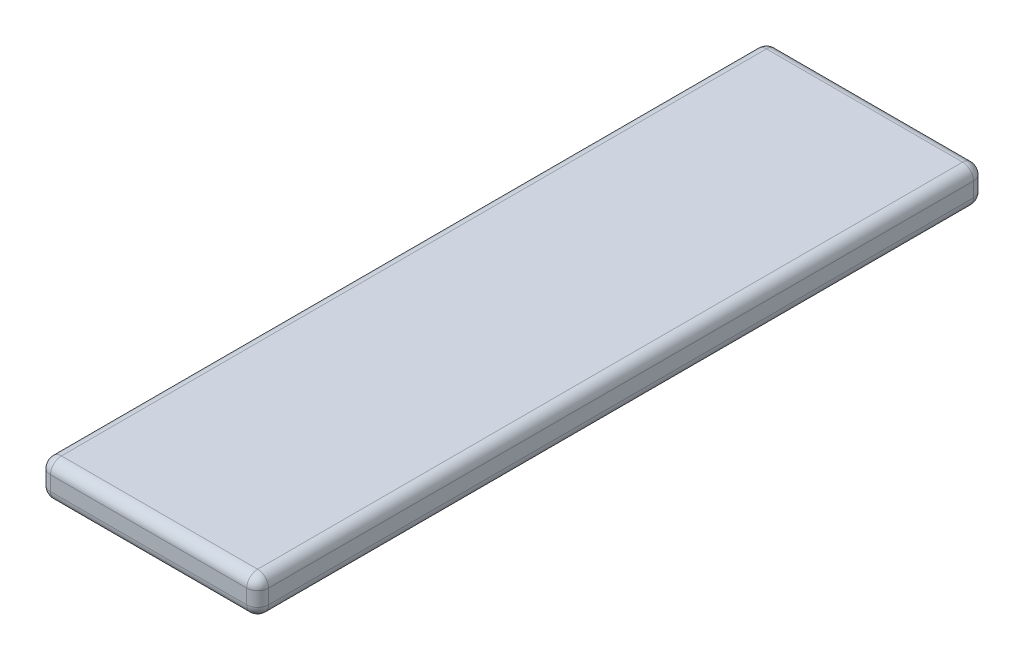
ISO-10303-21;
HEADER;
FILE_DESCRIPTION(('STEP AP214'),'2;1');
FILE_NAME('part.step','',(''),(''),'','','');
FILE_SCHEMA(('AUTOMOTIVE_DESIGN { 1 0 10303 214 1 1 1 1 }'));
ENDSEC;
DATA;
#1=APPLICATION_CONTEXT('core data for automotive mechanical design processes');
#2=APPLICATION_PROTOCOL_DEFINITION('international standard','automotive_design',2000,#1);
#3=PRODUCT_CONTEXT('',#1,'mechanical');
#4=PRODUCT('Part','Part','',(#3));
#5=PRODUCT_RELATED_PRODUCT_CATEGORY('part','',(#4));
#6=PRODUCT_DEFINITION_FORMATION('','',#4);
#7=PRODUCT_DEFINITION_CONTEXT('part definition',#1,'design');
#8=PRODUCT_DEFINITION('design','',#6,#7);
#9=PRODUCT_DEFINITION_SHAPE('','',#8);
#10=(LENGTH_UNIT() NAMED_UNIT(*) SI_UNIT(.MILLI.,.METRE.));
#11=(NAMED_UNIT(*) PLANE_ANGLE_UNIT() SI_UNIT($,.RADIAN.));
#12=(NAMED_UNIT(*) SI_UNIT($,.STERADIAN.) SOLID_ANGLE_UNIT());
#13=UNCERTAINTY_MEASURE_WITH_UNIT(LENGTH_MEASURE(1.E-05),#10,'distance_accuracy_value','');
#14=(GEOMETRIC_REPRESENTATION_CONTEXT(3) GLOBAL_UNCERTAINTY_ASSIGNED_CONTEXT((#13)) GLOBAL_UNIT_ASSIGNED_CONTEXT((#10,
#11,#12)) REPRESENTATION_CONTEXT('',''));
#15=CARTESIAN_POINT('',(0.,0.,0.));
#16=DIRECTION('',(0.,0.,1.));
#17=DIRECTION('',(1.,0.,0.));
#18=AXIS2_PLACEMENT_3D('',#15,#16,#17);
#19=CARTESIAN_POINT('',(-300.,100.,-1000.));
#20=DIRECTION('',(1.,0.,0.));
#21=DIRECTION('',(0.,0.,-1.));
#22=AXIS2_PLACEMENT_3D('',#19,#20,#21);
#23=PLANE('',#22);
#24=DIRECTION('',(0.,0.,1.));
#25=VECTOR('',#24,1.);
#26=CARTESIAN_POINT('',(-300.,30.,1000.));
#27=LINE('',#26,#25);
#28=CARTESIAN_POINT('',(-300.,30.,-970.));
#29=VERTEX_POINT('',#28);
#30=CARTESIAN_POINT('',(-300.,30.,970.));
#31=VERTEX_POINT('',#30);
#32=EDGE_CURVE('E280',#29,#31,#27,.T.);
#33=ORIENTED_EDGE('',*,*,#32,.T.);
#34=DIRECTION('',(0.,-1.,0.));
#35=VECTOR('',#34,1.);
#36=CARTESIAN_POINT('',(-300.,100.,970.));
#37=LINE('',#36,#35);
#38=CARTESIAN_POINT('',(-300.,70.,970.));
#39=VERTEX_POINT('',#38);
#40=EDGE_CURVE('E212',#31,#39,#37,.F.);
#41=ORIENTED_EDGE('',*,*,#40,.T.);
#42=DIRECTION('',(0.,0.,1.));
#43=VECTOR('',#42,1.);
#44=CARTESIAN_POINT('',(-300.,70.,-1000.));
#45=LINE('',#44,#43);
#46=CARTESIAN_POINT('',(-300.,70.,-970.));
#47=VERTEX_POINT('',#46);
#48=EDGE_CURVE('E273',#39,#47,#45,.F.);
#49=ORIENTED_EDGE('',*,*,#48,.T.);
#50=DIRECTION('',(0.,-1.,0.));
#51=VECTOR('',#50,1.);
#52=CARTESIAN_POINT('',(-300.,100.,-970.));
#53=LINE('',#52,#51);
#54=EDGE_CURVE('E275',#47,#29,#53,.T.);
#55=ORIENTED_EDGE('',*,*,#54,.T.);
#56=EDGE_LOOP('',(#33,#41,#49,#55));
#57=FACE_BOUND('',#56,.T.);
#58=ADVANCED_FACE('F33',(#57),#23,.F.);
#59=CARTESIAN_POINT('',(300.,100.,1000.));
#60=DIRECTION('',(0.,0.,-1.));
#61=DIRECTION('',(-1.,0.,0.));
#62=AXIS2_PLACEMENT_3D('',#59,#60,#61);
#63=PLANE('',#62);
#64=DIRECTION('',(0.,-1.,0.));
#65=VECTOR('',#64,1.);
#66=CARTESIAN_POINT('',(-270.,100.,1000.));
#67=LINE('',#66,#65);
#68=CARTESIAN_POINT('',(-270.,70.,1000.));
#69=VERTEX_POINT('',#68);
#70=CARTESIAN_POINT('',(-270.,30.,1000.));
#71=VERTEX_POINT('',#70);
#72=EDGE_CURVE('E131',#69,#71,#67,.T.);
#73=ORIENTED_EDGE('',*,*,#72,.T.);
#74=DIRECTION('',(1.,0.,0.));
#75=VECTOR('',#74,1.);
#76=CARTESIAN_POINT('',(300.,30.,1000.));
#77=LINE('',#76,#75);
#78=CARTESIAN_POINT('',(270.,30.,1000.));
#79=VERTEX_POINT('',#78);
#80=EDGE_CURVE('E127',#71,#79,#77,.T.);
#81=ORIENTED_EDGE('',*,*,#80,.T.);
#82=DIRECTION('',(0.,-1.,0.));
#83=VECTOR('',#82,1.);
#84=CARTESIAN_POINT('',(270.,100.,1000.));
#85=LINE('',#84,#83);
#86=CARTESIAN_POINT('',(270.,70.,1000.));
#87=VERTEX_POINT('',#86);
#88=EDGE_CURVE('E121',#79,#87,#85,.F.);
#89=ORIENTED_EDGE('',*,*,#88,.T.);
#90=DIRECTION('',(1.,0.,0.));
#91=VECTOR('',#90,1.);
#92=CARTESIAN_POINT('',(300.,70.,1000.));
#93=LINE('',#92,#91);
#94=EDGE_CURVE('E124',#87,#69,#93,.F.);
#95=ORIENTED_EDGE('',*,*,#94,.T.);
#96=EDGE_LOOP('',(#73,#81,#89,#95));
#97=FACE_BOUND('',#96,.T.);
#98=ADVANCED_FACE('F123',(#97),#63,.F.);
#99=CARTESIAN_POINT('',(300.,100.,-1000.));
#100=DIRECTION('',(-1.,0.,0.));
#101=DIRECTION('',(0.,0.,1.));
#102=AXIS2_PLACEMENT_3D('',#99,#100,#101);
#103=PLANE('',#102);
#104=DIRECTION('',(0.,-1.,0.));
#105=VECTOR('',#104,1.);
#106=CARTESIAN_POINT('',(300.,100.,970.));
#107=LINE('',#106,#105);
#108=CARTESIAN_POINT('',(300.,70.,970.));
#109=VERTEX_POINT('',#108);
#110=CARTESIAN_POINT('',(300.,30.,970.));
#111=VERTEX_POINT('',#110);
#112=EDGE_CURVE('E153',#109,#111,#107,.T.);
#113=ORIENTED_EDGE('',*,*,#112,.T.);
#114=DIRECTION('',(0.,0.,-1.));
#115=VECTOR('',#114,1.);
#116=CARTESIAN_POINT('',(300.,30.,-1000.));
#117=LINE('',#116,#115);
#118=CARTESIAN_POINT('',(300.,30.,-970.));
#119=VERTEX_POINT('',#118);
#120=EDGE_CURVE('E231',#111,#119,#117,.T.);
#121=ORIENTED_EDGE('',*,*,#120,.T.);
#122=DIRECTION('',(0.,-1.,0.));
#123=VECTOR('',#122,1.);
#124=CARTESIAN_POINT('',(300.,100.,-970.));
#125=LINE('',#124,#123);
#126=CARTESIAN_POINT('',(300.,70.,-970.));
#127=VERTEX_POINT('',#126);
#128=EDGE_CURVE('E224',#119,#127,#125,.F.);
#129=ORIENTED_EDGE('',*,*,#128,.T.);
#130=DIRECTION('',(0.,0.,-1.));
#131=VECTOR('',#130,1.);
#132=CARTESIAN_POINT('',(300.,70.,-1000.));
#133=LINE('',#132,#131);
#134=EDGE_CURVE('E222',#127,#109,#133,.F.);
#135=ORIENTED_EDGE('',*,*,#134,.T.);
#136=EDGE_LOOP('',(#113,#121,#129,#135));
#137=FACE_BOUND('',#136,.T.);
#138=ADVANCED_FACE('F324',(#137),#103,.F.);
#139=CARTESIAN_POINT('',(300.,100.,-1000.));
#140=DIRECTION('',(0.,0.,1.));
#141=DIRECTION('',(1.,0.,0.));
#142=AXIS2_PLACEMENT_3D('',#139,#140,#141);
#143=PLANE('',#142);
#144=DIRECTION('',(-1.,0.,0.));
#145=VECTOR('',#144,1.);
#146=CARTESIAN_POINT('',(-300.,30.,-1000.));
#147=LINE('',#146,#145);
#148=CARTESIAN_POINT('',(270.,30.,-1000.));
#149=VERTEX_POINT('',#148);
#150=CARTESIAN_POINT('',(-270.,30.,-1000.));
#151=VERTEX_POINT('',#150);
#152=EDGE_CURVE('E218',#149,#151,#147,.T.);
#153=ORIENTED_EDGE('',*,*,#152,.T.);
#154=DIRECTION('',(0.,-1.,0.));
#155=VECTOR('',#154,1.);
#156=CARTESIAN_POINT('',(-270.,100.,-1000.));
#157=LINE('',#156,#155);
#158=CARTESIAN_POINT('',(-270.,70.,-1000.));
#159=VERTEX_POINT('',#158);
#160=EDGE_CURVE('E215',#151,#159,#157,.F.);
#161=ORIENTED_EDGE('',*,*,#160,.T.);
#162=DIRECTION('',(-1.,0.,0.));
#163=VECTOR('',#162,1.);
#164=CARTESIAN_POINT('',(300.,70.,-1000.));
#165=LINE('',#164,#163);
#166=CARTESIAN_POINT('',(270.,70.,-1000.));
#167=VERTEX_POINT('',#166);
#168=EDGE_CURVE('E208',#159,#167,#165,.F.);
#169=ORIENTED_EDGE('',*,*,#168,.T.);
#170=DIRECTION('',(0.,-1.,0.));
#171=VECTOR('',#170,1.);
#172=CARTESIAN_POINT('',(270.,100.,-1000.));
#173=LINE('',#172,#171);
#174=EDGE_CURVE('E211',#167,#149,#173,.T.);
#175=ORIENTED_EDGE('',*,*,#174,.T.);
#176=EDGE_LOOP('',(#153,#161,#169,#175));
#177=FACE_BOUND('',#176,.T.);
#178=ADVANCED_FACE('F216',(#177),#143,.F.);
#179=CARTESIAN_POINT('',(0.,100.,0.));
#180=DIRECTION('',(0.,-1.,0.));
#181=DIRECTION('',(0.,0.,-1.));
#182=AXIS2_PLACEMENT_3D('',#179,#180,#181);
#183=PLANE('',#182);
#184=DIRECTION('',(0.,0.,-1.));
#185=VECTOR('',#184,1.);
#186=CARTESIAN_POINT('',(270.,100.,0.));
#187=LINE('',#186,#185);
#188=CARTESIAN_POINT('',(270.,100.,970.));
#189=VERTEX_POINT('',#188);
#190=CARTESIAN_POINT('',(270.,100.,-970.));
#191=VERTEX_POINT('',#190);
#192=EDGE_CURVE('E42',#189,#191,#187,.T.);
#193=ORIENTED_EDGE('',*,*,#192,.T.);
#194=DIRECTION('',(-1.,0.,0.));
#195=VECTOR('',#194,1.);
#196=CARTESIAN_POINT('',(0.,100.,-970.));
#197=LINE('',#196,#195);
#198=CARTESIAN_POINT('',(-270.,100.,-970.));
#199=VERTEX_POINT('',#198);
#200=EDGE_CURVE('E11',#191,#199,#197,.T.);
#201=ORIENTED_EDGE('',*,*,#200,.T.);
#202=DIRECTION('',(0.,0.,1.));
#203=VECTOR('',#202,1.);
#204=CARTESIAN_POINT('',(-270.,100.,0.));
#205=LINE('',#204,#203);
#206=CARTESIAN_POINT('',(-270.,100.,970.));
#207=VERTEX_POINT('',#206);
#208=EDGE_CURVE('E233',#199,#207,#205,.T.);
#209=ORIENTED_EDGE('',*,*,#208,.T.);
#210=DIRECTION('',(1.,0.,0.));
#211=VECTOR('',#210,1.);
#212=CARTESIAN_POINT('',(0.,100.,970.));
#213=LINE('',#212,#211);
#214=EDGE_CURVE('E53',#207,#189,#213,.T.);
#215=ORIENTED_EDGE('',*,*,#214,.T.);
#216=EDGE_LOOP('',(#193,#201,#209,#215));
#217=FACE_BOUND('',#216,.T.);
#218=ADVANCED_FACE('F482',(#217),#183,.F.);
#219=CARTESIAN_POINT('',(0.,0.,0.));
#220=DIRECTION('',(0.,-1.,0.));
#221=DIRECTION('',(0.,0.,-1.));
#222=AXIS2_PLACEMENT_3D('',#219,#220,#221);
#223=PLANE('',#222);
#224=DIRECTION('',(0.,0.,-1.));
#225=VECTOR('',#224,1.);
#226=CARTESIAN_POINT('',(270.,0.,1000.));
#227=LINE('',#226,#225);
#228=CARTESIAN_POINT('',(270.,0.,-970.));
#229=VERTEX_POINT('',#228);
#230=CARTESIAN_POINT('',(270.,0.,970.));
#231=VERTEX_POINT('',#230);
#232=EDGE_CURVE('E269',#229,#231,#227,.F.);
#233=ORIENTED_EDGE('',*,*,#232,.T.);
#234=DIRECTION('',(1.,0.,0.));
#235=VECTOR('',#234,1.);
#236=CARTESIAN_POINT('',(-300.,0.,970.));
#237=LINE('',#236,#235);
#238=CARTESIAN_POINT('',(-270.,0.,970.));
#239=VERTEX_POINT('',#238);
#240=EDGE_CURVE('E263',#231,#239,#237,.F.);
#241=ORIENTED_EDGE('',*,*,#240,.T.);
#242=DIRECTION('',(0.,0.,1.));
#243=VECTOR('',#242,1.);
#244=CARTESIAN_POINT('',(-270.,0.,-1000.));
#245=LINE('',#244,#243);
#246=CARTESIAN_POINT('',(-270.,0.,-970.));
#247=VERTEX_POINT('',#246);
#248=EDGE_CURVE('E257',#239,#247,#245,.F.);
#249=ORIENTED_EDGE('',*,*,#248,.T.);
#250=DIRECTION('',(-1.,0.,0.));
#251=VECTOR('',#250,1.);
#252=CARTESIAN_POINT('',(300.,0.,-970.));
#253=LINE('',#252,#251);
#254=EDGE_CURVE('E264',#247,#229,#253,.F.);
#255=ORIENTED_EDGE('',*,*,#254,.T.);
#256=EDGE_LOOP('',(#233,#241,#249,#255));
#257=FACE_BOUND('',#256,.T.);
#258=ADVANCED_FACE('F267',(#257),#223,.T.);
#259=CARTESIAN_POINT('',(0.,70.,-970.));
#260=DIRECTION('',(-1.,0.,0.));
#261=DIRECTION('',(0.,0.,1.));
#262=AXIS2_PLACEMENT_3D('',#259,#260,#261);
#263=CYLINDRICAL_SURFACE('',#262,30.);
#264=CARTESIAN_POINT('',(-270.,70.,-970.));
#265=DIRECTION('',(-1.,0.,0.));
#266=DIRECTION('',(0.,0.,1.));
#267=AXIS2_PLACEMENT_3D('',#264,#265,#266);
#268=CIRCLE('',#267,30.);
#269=EDGE_CURVE('E37',#199,#159,#268,.T.);
#270=ORIENTED_EDGE('',*,*,#269,.F.);
#271=ORIENTED_EDGE('',*,*,#200,.F.);
#272=CARTESIAN_POINT('',(270.,70.,-970.));
#273=DIRECTION('',(1.,0.,0.));
#274=DIRECTION('',(0.,0.,-1.));
#275=AXIS2_PLACEMENT_3D('',#272,#273,#274);
#276=CIRCLE('',#275,30.);
#277=EDGE_CURVE('E193',#167,#191,#276,.T.);
#278=ORIENTED_EDGE('',*,*,#277,.F.);
#279=ORIENTED_EDGE('',*,*,#168,.F.);
#280=EDGE_LOOP('',(#270,#271,#278,#279));
#281=FACE_BOUND('',#280,.T.);
#282=ADVANCED_FACE('F35',(#281),#263,.T.);
#283=CARTESIAN_POINT('',(-270.,70.,-970.));
#284=DIRECTION('',(0.,0.,1.));
#285=DIRECTION('',(1.,0.,0.));
#286=AXIS2_PLACEMENT_3D('',#283,#284,#285);
#287=SPHERICAL_SURFACE('',#286,30.);
#288=CARTESIAN_POINT('',(-270.,70.,-970.));
#289=DIRECTION('',(0.,0.,-1.));
#290=DIRECTION('',(-1.,0.,0.));
#291=AXIS2_PLACEMENT_3D('',#288,#289,#290);
#292=CIRCLE('',#291,30.);
#293=EDGE_CURVE('E189',#199,#47,#292,.F.);
#294=ORIENTED_EDGE('',*,*,#293,.F.);
#295=ORIENTED_EDGE('',*,*,#269,.T.);
#296=CARTESIAN_POINT('',(-270.,70.,-970.));
#297=DIRECTION('',(0.,1.,0.));
#298=DIRECTION('',(0.,0.,1.));
#299=AXIS2_PLACEMENT_3D('',#296,#297,#298);
#300=CIRCLE('',#299,30.);
#301=EDGE_CURVE('E192',#47,#159,#300,.F.);
#302=ORIENTED_EDGE('',*,*,#301,.F.);
#303=EDGE_LOOP('',(#294,#295,#302));
#304=FACE_BOUND('',#303,.T.);
#305=ADVANCED_FACE('F205',(#304),#287,.T.);
#306=CARTESIAN_POINT('',(270.,70.,-970.));
#307=DIRECTION('',(0.,0.,1.));
#308=DIRECTION('',(1.,0.,0.));
#309=AXIS2_PLACEMENT_3D('',#306,#307,#308);
#310=SPHERICAL_SURFACE('',#309,30.);
#311=CARTESIAN_POINT('',(270.,70.,-970.));
#312=DIRECTION('',(0.,1.,0.));
#313=DIRECTION('',(0.,0.,1.));
#314=AXIS2_PLACEMENT_3D('',#311,#312,#313);
#315=CIRCLE('',#314,30.);
#316=EDGE_CURVE('E183',#167,#127,#315,.F.);
#317=ORIENTED_EDGE('',*,*,#316,.F.);
#318=ORIENTED_EDGE('',*,*,#277,.T.);
#319=CARTESIAN_POINT('',(270.,70.,-970.));
#320=DIRECTION('',(0.,0.,-1.));
#321=DIRECTION('',(-1.,0.,0.));
#322=AXIS2_PLACEMENT_3D('',#319,#320,#321);
#323=CIRCLE('',#322,30.);
#324=EDGE_CURVE('E186',#127,#191,#323,.F.);
#325=ORIENTED_EDGE('',*,*,#324,.F.);
#326=EDGE_LOOP('',(#317,#318,#325));
#327=FACE_BOUND('',#326,.T.);
#328=ADVANCED_FACE('F455',(#327),#310,.T.);
#329=CARTESIAN_POINT('',(-270.,100.,-970.));
#330=DIRECTION('',(0.,-1.,0.));
#331=DIRECTION('',(0.,0.,-1.));
#332=AXIS2_PLACEMENT_3D('',#329,#330,#331);
#333=CYLINDRICAL_SURFACE('',#332,30.);
#334=ORIENTED_EDGE('',*,*,#301,.T.);
#335=ORIENTED_EDGE('',*,*,#160,.F.);
#336=CARTESIAN_POINT('',(-270.,30.,-970.));
#337=DIRECTION('',(0.,-1.,0.));
#338=DIRECTION('',(0.,0.,-1.));
#339=AXIS2_PLACEMENT_3D('',#336,#337,#338);
#340=CIRCLE('',#339,30.);
#341=EDGE_CURVE('E177',#29,#151,#340,.T.);
#342=ORIENTED_EDGE('',*,*,#341,.F.);
#343=ORIENTED_EDGE('',*,*,#54,.F.);
#344=EDGE_LOOP('',(#334,#335,#342,#343));
#345=FACE_BOUND('',#344,.T.);
#346=ADVANCED_FACE('F306',(#345),#333,.T.);
#347=CARTESIAN_POINT('',(-270.,70.,0.));
#348=DIRECTION('',(0.,0.,1.));
#349=DIRECTION('',(1.,0.,0.));
#350=AXIS2_PLACEMENT_3D('',#347,#348,#349);
#351=CYLINDRICAL_SURFACE('',#350,30.);
#352=ORIENTED_EDGE('',*,*,#293,.T.);
#353=ORIENTED_EDGE('',*,*,#48,.F.);
#354=CARTESIAN_POINT('',(-270.,70.,970.));
#355=DIRECTION('',(0.,0.,1.));
#356=DIRECTION('',(1.,0.,0.));
#357=AXIS2_PLACEMENT_3D('',#354,#355,#356);
#358=CIRCLE('',#357,30.);
#359=EDGE_CURVE('E174',#207,#39,#358,.T.);
#360=ORIENTED_EDGE('',*,*,#359,.F.);
#361=ORIENTED_EDGE('',*,*,#208,.F.);
#362=EDGE_LOOP('',(#352,#353,#360,#361));
#363=FACE_BOUND('',#362,.T.);
#364=ADVANCED_FACE('F439',(#363),#351,.T.);
#365=CARTESIAN_POINT('',(0.,70.,970.));
#366=DIRECTION('',(1.,0.,0.));
#367=DIRECTION('',(0.,0.,-1.));
#368=AXIS2_PLACEMENT_3D('',#365,#366,#367);
#369=CYLINDRICAL_SURFACE('',#368,30.);
#370=CARTESIAN_POINT('',(270.,70.,970.));
#371=DIRECTION('',(1.,0.,0.));
#372=DIRECTION('',(0.,0.,-1.));
#373=AXIS2_PLACEMENT_3D('',#370,#371,#372);
#374=CIRCLE('',#373,30.);
#375=EDGE_CURVE('E137',#189,#87,#374,.T.);
#376=ORIENTED_EDGE('',*,*,#375,.F.);
#377=ORIENTED_EDGE('',*,*,#214,.F.);
#378=CARTESIAN_POINT('',(-270.,70.,970.));
#379=DIRECTION('',(-1.,0.,0.));
#380=DIRECTION('',(0.,-1.,0.));
#381=AXIS2_PLACEMENT_3D('',#378,#379,#380);
#382=CIRCLE('',#381,30.);
#383=EDGE_CURVE('E140',#69,#207,#382,.T.);
#384=ORIENTED_EDGE('',*,*,#383,.F.);
#385=ORIENTED_EDGE('',*,*,#94,.F.);
#386=EDGE_LOOP('',(#376,#377,#384,#385));
#387=FACE_BOUND('',#386,.T.);
#388=ADVANCED_FACE('F136',(#387),#369,.T.);
#389=CARTESIAN_POINT('',(270.,70.,0.));
#390=DIRECTION('',(0.,0.,-1.));
#391=DIRECTION('',(-1.,0.,0.));
#392=AXIS2_PLACEMENT_3D('',#389,#390,#391);
#393=CYLINDRICAL_SURFACE('',#392,30.);
#394=ORIENTED_EDGE('',*,*,#324,.T.);
#395=ORIENTED_EDGE('',*,*,#192,.F.);
#396=CARTESIAN_POINT('',(270.,70.,970.));
#397=DIRECTION('',(0.,0.,1.));
#398=DIRECTION('',(1.,0.,0.));
#399=AXIS2_PLACEMENT_3D('',#396,#397,#398);
#400=CIRCLE('',#399,30.);
#401=EDGE_CURVE('E149',#109,#189,#400,.T.);
#402=ORIENTED_EDGE('',*,*,#401,.F.);
#403=ORIENTED_EDGE('',*,*,#134,.F.);
#404=EDGE_LOOP('',(#394,#395,#402,#403));
#405=FACE_BOUND('',#404,.T.);
#406=ADVANCED_FACE('F423',(#405),#393,.T.);
#407=CARTESIAN_POINT('',(270.,100.,-970.));
#408=DIRECTION('',(0.,-1.,0.));
#409=DIRECTION('',(0.,0.,-1.));
#410=AXIS2_PLACEMENT_3D('',#407,#408,#409);
#411=CYLINDRICAL_SURFACE('',#410,30.);
#412=ORIENTED_EDGE('',*,*,#316,.T.);
#413=ORIENTED_EDGE('',*,*,#128,.F.);
#414=CARTESIAN_POINT('',(270.,30.,-970.));
#415=DIRECTION('',(0.,-1.,0.));
#416=DIRECTION('',(0.,0.,-1.));
#417=AXIS2_PLACEMENT_3D('',#414,#415,#416);
#418=CIRCLE('',#417,30.);
#419=EDGE_CURVE('E169',#149,#119,#418,.T.);
#420=ORIENTED_EDGE('',*,*,#419,.F.);
#421=ORIENTED_EDGE('',*,*,#174,.F.);
#422=EDGE_LOOP('',(#412,#413,#420,#421));
#423=FACE_BOUND('',#422,.T.);
#424=ADVANCED_FACE('F291',(#423),#411,.T.);
#425=CARTESIAN_POINT('',(300.,30.,-970.));
#426=DIRECTION('',(1.,0.,0.));
#427=DIRECTION('',(0.,0.,-1.));
#428=AXIS2_PLACEMENT_3D('',#425,#426,#427);
#429=CYLINDRICAL_SURFACE('',#428,30.);
#430=CARTESIAN_POINT('',(-270.,30.,-970.));
#431=DIRECTION('',(-1.,0.,0.));
#432=DIRECTION('',(0.,0.,1.));
#433=AXIS2_PLACEMENT_3D('',#430,#431,#432);
#434=CIRCLE('',#433,30.);
#435=EDGE_CURVE('E180',#151,#247,#434,.T.);
#436=ORIENTED_EDGE('',*,*,#435,.F.);
#437=ORIENTED_EDGE('',*,*,#152,.F.);
#438=CARTESIAN_POINT('',(270.,30.,-970.));
#439=DIRECTION('',(1.,0.,0.));
#440=DIRECTION('',(0.,0.,-1.));
#441=AXIS2_PLACEMENT_3D('',#438,#439,#440);
#442=CIRCLE('',#441,30.);
#443=EDGE_CURVE('E166',#229,#149,#442,.T.);
#444=ORIENTED_EDGE('',*,*,#443,.F.);
#445=ORIENTED_EDGE('',*,*,#254,.F.);
#446=EDGE_LOOP('',(#436,#437,#444,#445));
#447=FACE_BOUND('',#446,.T.);
#448=ADVANCED_FACE('F288',(#447),#429,.T.);
#449=CARTESIAN_POINT('',(-270.,30.,-970.));
#450=DIRECTION('',(0.,0.,1.));
#451=DIRECTION('',(1.,0.,0.));
#452=AXIS2_PLACEMENT_3D('',#449,#450,#451);
#453=SPHERICAL_SURFACE('',#452,30.);
#454=ORIENTED_EDGE('',*,*,#341,.T.);
#455=ORIENTED_EDGE('',*,*,#435,.T.);
#456=CARTESIAN_POINT('',(-270.,30.,-970.));
#457=DIRECTION('',(0.,0.,-1.));
#458=DIRECTION('',(-1.,0.,0.));
#459=AXIS2_PLACEMENT_3D('',#456,#457,#458);
#460=CIRCLE('',#459,30.);
#461=EDGE_CURVE('E157',#29,#247,#460,.F.);
#462=ORIENTED_EDGE('',*,*,#461,.F.);
#463=EDGE_LOOP('',(#454,#455,#462));
#464=FACE_BOUND('',#463,.T.);
#465=ADVANCED_FACE('F308',(#464),#453,.T.);
#466=CARTESIAN_POINT('',(-270.,70.,970.));
#467=DIRECTION('',(0.,0.,1.));
#468=DIRECTION('',(1.,0.,0.));
#469=AXIS2_PLACEMENT_3D('',#466,#467,#468);
#470=SPHERICAL_SURFACE('',#469,30.);
#471=ORIENTED_EDGE('',*,*,#383,.T.);
#472=ORIENTED_EDGE('',*,*,#359,.T.);
#473=CARTESIAN_POINT('',(-270.,70.,970.));
#474=DIRECTION('',(0.,1.,0.));
#475=DIRECTION('',(0.,0.,1.));
#476=AXIS2_PLACEMENT_3D('',#473,#474,#475);
#477=CIRCLE('',#476,30.);
#478=EDGE_CURVE('E154',#69,#39,#477,.F.);
#479=ORIENTED_EDGE('',*,*,#478,.F.);
#480=EDGE_LOOP('',(#471,#472,#479));
#481=FACE_BOUND('',#480,.T.);
#482=ADVANCED_FACE('F310',(#481),#470,.T.);
#483=CARTESIAN_POINT('',(270.,70.,970.));
#484=DIRECTION('',(0.,0.,1.));
#485=DIRECTION('',(1.,0.,0.));
#486=AXIS2_PLACEMENT_3D('',#483,#484,#485);
#487=SPHERICAL_SURFACE('',#486,30.);
#488=ORIENTED_EDGE('',*,*,#401,.T.);
#489=ORIENTED_EDGE('',*,*,#375,.T.);
#490=CARTESIAN_POINT('',(270.,70.,970.));
#491=DIRECTION('',(0.,1.,0.));
#492=DIRECTION('',(0.,0.,1.));
#493=AXIS2_PLACEMENT_3D('',#490,#491,#492);
#494=CIRCLE('',#493,30.);
#495=EDGE_CURVE('E146',#109,#87,#494,.F.);
#496=ORIENTED_EDGE('',*,*,#495,.F.);
#497=EDGE_LOOP('',(#488,#489,#496));
#498=FACE_BOUND('',#497,.T.);
#499=ADVANCED_FACE('F145',(#498),#487,.T.);
#500=CARTESIAN_POINT('',(270.,30.,-970.));
#501=DIRECTION('',(0.,0.,1.));
#502=DIRECTION('',(1.,0.,0.));
#503=AXIS2_PLACEMENT_3D('',#500,#501,#502);
#504=SPHERICAL_SURFACE('',#503,30.);
#505=ORIENTED_EDGE('',*,*,#443,.T.);
#506=ORIENTED_EDGE('',*,*,#419,.T.);
#507=CARTESIAN_POINT('',(270.,30.,-970.));
#508=DIRECTION('',(0.,0.,-1.));
#509=DIRECTION('',(-1.,0.,0.));
#510=AXIS2_PLACEMENT_3D('',#507,#508,#509);
#511=CIRCLE('',#510,30.);
#512=EDGE_CURVE('E155',#229,#119,#511,.F.);
#513=ORIENTED_EDGE('',*,*,#512,.F.);
#514=EDGE_LOOP('',(#505,#506,#513));
#515=FACE_BOUND('',#514,.T.);
#516=ADVANCED_FACE('F293',(#515),#504,.T.);
#517=CARTESIAN_POINT('',(-270.,30.,-1000.));
#518=DIRECTION('',(0.,0.,-1.));
#519=DIRECTION('',(-1.,0.,0.));
#520=AXIS2_PLACEMENT_3D('',#517,#518,#519);
#521=CYLINDRICAL_SURFACE('',#520,30.);
#522=ORIENTED_EDGE('',*,*,#461,.T.);
#523=ORIENTED_EDGE('',*,*,#248,.F.);
#524=CARTESIAN_POINT('',(-270.,30.,970.));
#525=DIRECTION('',(0.,0.,1.));
#526=DIRECTION('',(1.,0.,0.));
#527=AXIS2_PLACEMENT_3D('',#524,#525,#526);
#528=CIRCLE('',#527,30.);
#529=EDGE_CURVE('E160',#31,#239,#528,.T.);
#530=ORIENTED_EDGE('',*,*,#529,.F.);
#531=ORIENTED_EDGE('',*,*,#32,.F.);
#532=EDGE_LOOP('',(#522,#523,#530,#531));
#533=FACE_BOUND('',#532,.T.);
#534=ADVANCED_FACE('F259',(#533),#521,.T.);
#535=CARTESIAN_POINT('',(-270.,100.,970.));
#536=DIRECTION('',(0.,-1.,0.));
#537=DIRECTION('',(0.,0.,-1.));
#538=AXIS2_PLACEMENT_3D('',#535,#536,#537);
#539=CYLINDRICAL_SURFACE('',#538,30.);
#540=ORIENTED_EDGE('',*,*,#478,.T.);
#541=ORIENTED_EDGE('',*,*,#40,.F.);
#542=CARTESIAN_POINT('',(-270.,30.,970.));
#543=DIRECTION('',(0.,-1.,0.));
#544=DIRECTION('',(0.,0.,-1.));
#545=AXIS2_PLACEMENT_3D('',#542,#543,#544);
#546=CIRCLE('',#545,30.);
#547=EDGE_CURVE('E246',#71,#31,#546,.T.);
#548=ORIENTED_EDGE('',*,*,#547,.F.);
#549=ORIENTED_EDGE('',*,*,#72,.F.);
#550=EDGE_LOOP('',(#540,#541,#548,#549));
#551=FACE_BOUND('',#550,.T.);
#552=ADVANCED_FACE('F303',(#551),#539,.T.);
#553=CARTESIAN_POINT('',(270.,100.,970.));
#554=DIRECTION('',(0.,-1.,0.));
#555=DIRECTION('',(0.,0.,-1.));
#556=AXIS2_PLACEMENT_3D('',#553,#554,#555);
#557=CYLINDRICAL_SURFACE('',#556,30.);
#558=ORIENTED_EDGE('',*,*,#495,.T.);
#559=ORIENTED_EDGE('',*,*,#88,.F.);
#560=CARTESIAN_POINT('',(270.,30.,970.));
#561=DIRECTION('',(0.,-1.,0.));
#562=DIRECTION('',(0.,0.,-1.));
#563=AXIS2_PLACEMENT_3D('',#560,#561,#562);
#564=CIRCLE('',#563,30.);
#565=EDGE_CURVE('E243',#111,#79,#564,.T.);
#566=ORIENTED_EDGE('',*,*,#565,.F.);
#567=ORIENTED_EDGE('',*,*,#112,.F.);
#568=EDGE_LOOP('',(#558,#559,#566,#567));
#569=FACE_BOUND('',#568,.T.);
#570=ADVANCED_FACE('F151',(#569),#557,.T.);
#571=CARTESIAN_POINT('',(270.,30.,-1000.));
#572=DIRECTION('',(0.,0.,1.));
#573=DIRECTION('',(1.,0.,0.));
#574=AXIS2_PLACEMENT_3D('',#571,#572,#573);
#575=CYLINDRICAL_SURFACE('',#574,30.);
#576=ORIENTED_EDGE('',*,*,#512,.T.);
#577=ORIENTED_EDGE('',*,*,#120,.F.);
#578=CARTESIAN_POINT('',(270.,30.,970.));
#579=DIRECTION('',(0.,0.,1.));
#580=DIRECTION('',(1.,0.,0.));
#581=AXIS2_PLACEMENT_3D('',#578,#579,#580);
#582=CIRCLE('',#581,30.);
#583=EDGE_CURVE('E241',#231,#111,#582,.T.);
#584=ORIENTED_EDGE('',*,*,#583,.F.);
#585=ORIENTED_EDGE('',*,*,#232,.F.);
#586=EDGE_LOOP('',(#576,#577,#584,#585));
#587=FACE_BOUND('',#586,.T.);
#588=ADVANCED_FACE('F296',(#587),#575,.T.);
#589=CARTESIAN_POINT('',(-270.,30.,970.));
#590=DIRECTION('',(0.,0.,1.));
#591=DIRECTION('',(1.,0.,0.));
#592=AXIS2_PLACEMENT_3D('',#589,#590,#591);
#593=SPHERICAL_SURFACE('',#592,30.);
#594=ORIENTED_EDGE('',*,*,#547,.T.);
#595=ORIENTED_EDGE('',*,*,#529,.T.);
#596=CARTESIAN_POINT('',(-270.,30.,970.));
#597=DIRECTION('',(-1.,0.,0.));
#598=DIRECTION('',(0.,0.,1.));
#599=AXIS2_PLACEMENT_3D('',#596,#597,#598);
#600=CIRCLE('',#599,30.);
#601=EDGE_CURVE('E239',#71,#239,#600,.F.);
#602=ORIENTED_EDGE('',*,*,#601,.F.);
#603=EDGE_LOOP('',(#594,#595,#602));
#604=FACE_BOUND('',#603,.T.);
#605=ADVANCED_FACE('F253',(#604),#593,.T.);
#606=CARTESIAN_POINT('',(270.,30.,970.));
#607=DIRECTION('',(0.,0.,1.));
#608=DIRECTION('',(1.,0.,0.));
#609=AXIS2_PLACEMENT_3D('',#606,#607,#608);
#610=SPHERICAL_SURFACE('',#609,30.);
#611=ORIENTED_EDGE('',*,*,#583,.T.);
#612=ORIENTED_EDGE('',*,*,#565,.T.);
#613=CARTESIAN_POINT('',(270.,30.,970.));
#614=DIRECTION('',(1.,0.,0.));
#615=DIRECTION('',(0.,0.,-1.));
#616=AXIS2_PLACEMENT_3D('',#613,#614,#615);
#617=CIRCLE('',#616,30.);
#618=EDGE_CURVE('E237',#231,#79,#617,.F.);
#619=ORIENTED_EDGE('',*,*,#618,.F.);
#620=EDGE_LOOP('',(#611,#612,#619));
#621=FACE_BOUND('',#620,.T.);
#622=ADVANCED_FACE('F331',(#621),#610,.T.);
#623=CARTESIAN_POINT('',(300.,30.,970.));
#624=DIRECTION('',(-1.,0.,0.));
#625=DIRECTION('',(0.,0.,1.));
#626=AXIS2_PLACEMENT_3D('',#623,#624,#625);
#627=CYLINDRICAL_SURFACE('',#626,30.);
#628=ORIENTED_EDGE('',*,*,#601,.T.);
#629=ORIENTED_EDGE('',*,*,#240,.F.);
#630=ORIENTED_EDGE('',*,*,#618,.T.);
#631=ORIENTED_EDGE('',*,*,#80,.F.);
#632=EDGE_LOOP('',(#628,#629,#630,#631));
#633=FACE_BOUND('',#632,.T.);
#634=ADVANCED_FACE('F328',(#633),#627,.T.);
#635=CLOSED_SHELL('',(#58,#98,#138,#178,#218,#258,#282,#305,#328,#346,#364,#388,#406,#424,#448,
#465,#482,#499,#516,#534,#552,#570,#588,#605,#622,#634));
#636=MANIFOLD_SOLID_BREP('B2',#635);
#637=ADVANCED_BREP_SHAPE_REPRESENTATION('',(#18,#636),#14);
#638=SHAPE_DEFINITION_REPRESENTATION(#9,#637);
ENDSEC;
END-ISO-10303-21;
